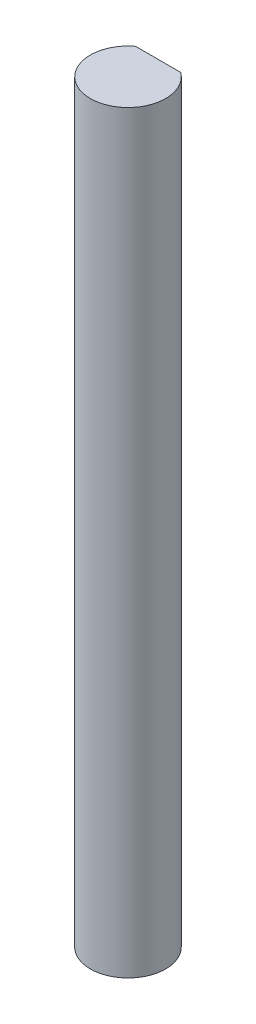
ISO-10303-21;
HEADER;
FILE_DESCRIPTION(('STEP AP214'),'2;1');
FILE_NAME('part.step','',(''),(''),'','','');
FILE_SCHEMA(('AUTOMOTIVE_DESIGN { 1 0 10303 214 1 1 1 1 }'));
ENDSEC;
DATA;
#1=APPLICATION_CONTEXT('core data for automotive mechanical design processes');
#2=APPLICATION_PROTOCOL_DEFINITION('international standard','automotive_design',2000,#1);
#3=PRODUCT_CONTEXT('',#1,'mechanical');
#4=PRODUCT('Part','Part','',(#3));
#5=PRODUCT_RELATED_PRODUCT_CATEGORY('part','',(#4));
#6=PRODUCT_DEFINITION_FORMATION('','',#4);
#7=PRODUCT_DEFINITION_CONTEXT('part definition',#1,'design');
#8=PRODUCT_DEFINITION('design','',#6,#7);
#9=PRODUCT_DEFINITION_SHAPE('','',#8);
#10=(LENGTH_UNIT() NAMED_UNIT(*) SI_UNIT(.MILLI.,.METRE.));
#11=(NAMED_UNIT(*) PLANE_ANGLE_UNIT() SI_UNIT($,.RADIAN.));
#12=(NAMED_UNIT(*) SI_UNIT($,.STERADIAN.) SOLID_ANGLE_UNIT());
#13=UNCERTAINTY_MEASURE_WITH_UNIT(LENGTH_MEASURE(1.E-05),#10,'distance_accuracy_value','');
#14=(GEOMETRIC_REPRESENTATION_CONTEXT(3) GLOBAL_UNCERTAINTY_ASSIGNED_CONTEXT((#13)) GLOBAL_UNIT_ASSIGNED_CONTEXT((#10,
#11,#12)) REPRESENTATION_CONTEXT('',''));
#15=CARTESIAN_POINT('',(0.,0.,0.));
#16=DIRECTION('',(0.,0.,1.));
#17=DIRECTION('',(1.,0.,0.));
#18=AXIS2_PLACEMENT_3D('',#15,#16,#17);
#19=CARTESIAN_POINT('',(0.,50.,0.));
#20=DIRECTION('',(0.,-1.,0.));
#21=DIRECTION('',(0.,0.,-1.));
#22=AXIS2_PLACEMENT_3D('',#19,#20,#21);
#23=CYLINDRICAL_SURFACE('',#22,2.5);
#24=CARTESIAN_POINT('',(0.,0.,0.));
#25=DIRECTION('',(0.,1.,0.));
#26=DIRECTION('',(0.,0.,1.));
#27=AXIS2_PLACEMENT_3D('',#24,#25,#26);
#28=CIRCLE('',#27,2.5);
#29=CARTESIAN_POINT('',(-1.5,0.,-2.));
#30=VERTEX_POINT('',#29);
#31=CARTESIAN_POINT('',(1.5,0.,-2.));
#32=VERTEX_POINT('',#31);
#33=EDGE_CURVE('E72',#30,#32,#28,.T.);
#34=ORIENTED_EDGE('',*,*,#33,.T.);
#35=DIRECTION('',(0.,-1.,0.));
#36=VECTOR('',#35,1.);
#37=CARTESIAN_POINT('',(1.5,50.,-2.));
#38=LINE('',#37,#36);
#39=CARTESIAN_POINT('',(1.5,50.,-2.));
#40=VERTEX_POINT('',#39);
#41=EDGE_CURVE('E11',#40,#32,#38,.T.);
#42=ORIENTED_EDGE('',*,*,#41,.F.);
#43=CARTESIAN_POINT('',(0.,50.,0.));
#44=DIRECTION('',(0.,1.,0.));
#45=DIRECTION('',(0.,0.,1.));
#46=AXIS2_PLACEMENT_3D('',#43,#44,#45);
#47=CIRCLE('',#46,2.5);
#48=CARTESIAN_POINT('',(-1.5,50.,-2.));
#49=VERTEX_POINT('',#48);
#50=EDGE_CURVE('E74',#49,#40,#47,.T.);
#51=ORIENTED_EDGE('',*,*,#50,.F.);
#52=DIRECTION('',(0.,-1.,0.));
#53=VECTOR('',#52,1.);
#54=CARTESIAN_POINT('',(-1.5,50.,-2.));
#55=LINE('',#54,#53);
#56=EDGE_CURVE('E56',#49,#30,#55,.T.);
#57=ORIENTED_EDGE('',*,*,#56,.T.);
#58=EDGE_LOOP('',(#34,#42,#51,#57));
#59=FACE_BOUND('',#58,.T.);
#60=ADVANCED_FACE('F47',(#59),#23,.T.);
#61=CARTESIAN_POINT('',(0.,50.,-2.));
#62=DIRECTION('',(0.,0.,-1.));
#63=DIRECTION('',(-1.,0.,0.));
#64=AXIS2_PLACEMENT_3D('',#61,#62,#63);
#65=PLANE('',#64);
#66=DIRECTION('',(1.,0.,0.));
#67=VECTOR('',#66,1.);
#68=CARTESIAN_POINT('',(0.,0.,-2.));
#69=LINE('',#68,#67);
#70=EDGE_CURVE('E80',#30,#32,#69,.T.);
#71=ORIENTED_EDGE('',*,*,#70,.F.);
#72=ORIENTED_EDGE('',*,*,#56,.F.);
#73=DIRECTION('',(1.,0.,0.));
#74=VECTOR('',#73,1.);
#75=CARTESIAN_POINT('',(0.,50.,-2.));
#76=LINE('',#75,#74);
#77=EDGE_CURVE('E77',#49,#40,#76,.T.);
#78=ORIENTED_EDGE('',*,*,#77,.T.);
#79=ORIENTED_EDGE('',*,*,#41,.T.);
#80=EDGE_LOOP('',(#71,#72,#78,#79));
#81=FACE_BOUND('',#80,.T.);
#82=ADVANCED_FACE('F83',(#81),#65,.T.);
#83=CARTESIAN_POINT('',(0.,50.,0.));
#84=DIRECTION('',(0.,1.,0.));
#85=DIRECTION('',(0.,0.,1.));
#86=AXIS2_PLACEMENT_3D('',#83,#84,#85);
#87=PLANE('',#86);
#88=ORIENTED_EDGE('',*,*,#50,.T.);
#89=ORIENTED_EDGE('',*,*,#77,.F.);
#90=EDGE_LOOP('',(#88,#89));
#91=FACE_BOUND('',#90,.T.);
#92=ADVANCED_FACE('F91',(#91),#87,.T.);
#93=CARTESIAN_POINT('',(0.,0.,0.));
#94=DIRECTION('',(0.,1.,0.));
#95=DIRECTION('',(0.,0.,1.));
#96=AXIS2_PLACEMENT_3D('',#93,#94,#95);
#97=PLANE('',#96);
#98=ORIENTED_EDGE('',*,*,#33,.F.);
#99=ORIENTED_EDGE('',*,*,#70,.T.);
#100=EDGE_LOOP('',(#98,#99));
#101=FACE_BOUND('',#100,.T.);
#102=ADVANCED_FACE('F79',(#101),#97,.F.);
#103=CLOSED_SHELL('',(#60,#82,#92,#102));
#104=MANIFOLD_SOLID_BREP('B2',#103);
#105=ADVANCED_BREP_SHAPE_REPRESENTATION('',(#18,#104),#14);
#106=SHAPE_DEFINITION_REPRESENTATION(#9,#105);
ENDSEC;
END-ISO-10303-21;
